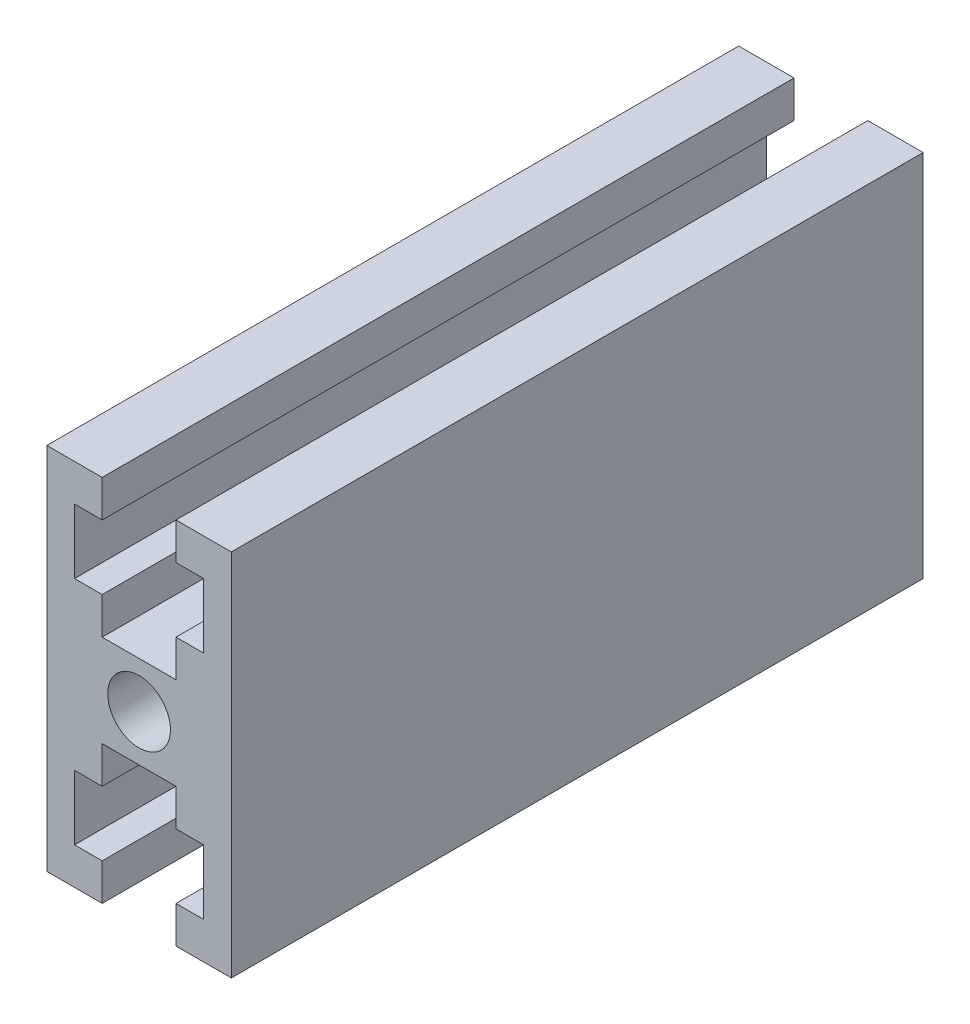
ISO-10303-21;
HEADER;
FILE_DESCRIPTION(('STEP AP214'),'2;1');
FILE_NAME('part.step','',(''),(''),'','','');
FILE_SCHEMA(('AUTOMOTIVE_DESIGN { 1 0 10303 214 1 1 1 1 }'));
ENDSEC;
DATA;
#1=APPLICATION_CONTEXT('core data for automotive mechanical design processes');
#2=APPLICATION_PROTOCOL_DEFINITION('international standard','automotive_design',2000,#1);
#3=PRODUCT_CONTEXT('',#1,'mechanical');
#4=PRODUCT('Part','Part','',(#3));
#5=PRODUCT_RELATED_PRODUCT_CATEGORY('part','',(#4));
#6=PRODUCT_DEFINITION_FORMATION('','',#4);
#7=PRODUCT_DEFINITION_CONTEXT('part definition',#1,'design');
#8=PRODUCT_DEFINITION('design','',#6,#7);
#9=PRODUCT_DEFINITION_SHAPE('','',#8);
#10=(LENGTH_UNIT() NAMED_UNIT(*) SI_UNIT(.MILLI.,.METRE.));
#11=(NAMED_UNIT(*) PLANE_ANGLE_UNIT() SI_UNIT($,.RADIAN.));
#12=(NAMED_UNIT(*) SI_UNIT($,.STERADIAN.) SOLID_ANGLE_UNIT());
#13=UNCERTAINTY_MEASURE_WITH_UNIT(LENGTH_MEASURE(1.E-05),#10,'distance_accuracy_value','');
#14=(GEOMETRIC_REPRESENTATION_CONTEXT(3) GLOBAL_UNCERTAINTY_ASSIGNED_CONTEXT((#13)) GLOBAL_UNIT_ASSIGNED_CONTEXT((#10,
#11,#12)) REPRESENTATION_CONTEXT('',''));
#15=CARTESIAN_POINT('',(0.,0.,0.));
#16=DIRECTION('',(0.,0.,1.));
#17=DIRECTION('',(1.,0.,0.));
#18=AXIS2_PLACEMENT_3D('',#15,#16,#17);
#19=CARTESIAN_POINT('',(0.,0.,75.));
#20=DIRECTION('',(0.,0.,1.));
#21=DIRECTION('',(1.,0.,0.));
#22=AXIS2_PLACEMENT_3D('',#19,#20,#21);
#23=PLANE('',#22);
#24=DIRECTION('',(0.,-1.,0.));
#25=VECTOR('',#24,1.);
#26=CARTESIAN_POINT('',(0.,0.,75.));
#27=LINE('',#26,#25);
#28=CARTESIAN_POINT('',(0.,0.,75.));
#29=VERTEX_POINT('',#28);
#30=CARTESIAN_POINT('',(0.,-40.,75.));
#31=VERTEX_POINT('',#30);
#32=EDGE_CURVE('E305',#29,#31,#27,.T.);
#33=ORIENTED_EDGE('',*,*,#32,.T.);
#34=DIRECTION('',(1.,0.,0.));
#35=VECTOR('',#34,1.);
#36=CARTESIAN_POINT('',(0.,-40.,75.));
#37=LINE('',#36,#35);
#38=CARTESIAN_POINT('',(6.,-40.,75.));
#39=VERTEX_POINT('',#38);
#40=EDGE_CURVE('E153',#31,#39,#37,.T.);
#41=ORIENTED_EDGE('',*,*,#40,.T.);
#42=DIRECTION('',(0.,1.,0.));
#43=VECTOR('',#42,1.);
#44=CARTESIAN_POINT('',(6.,-40.,75.));
#45=LINE('',#44,#43);
#46=CARTESIAN_POINT('',(6.,-36.,75.));
#47=VERTEX_POINT('',#46);
#48=EDGE_CURVE('E380',#39,#47,#45,.T.);
#49=ORIENTED_EDGE('',*,*,#48,.T.);
#50=DIRECTION('',(-1.,0.,0.));
#51=VECTOR('',#50,1.);
#52=CARTESIAN_POINT('',(6.,-36.,75.));
#53=LINE('',#52,#51);
#54=CARTESIAN_POINT('',(3.,-36.,75.));
#55=VERTEX_POINT('',#54);
#56=EDGE_CURVE('E399',#47,#55,#53,.T.);
#57=ORIENTED_EDGE('',*,*,#56,.T.);
#58=DIRECTION('',(0.,1.,0.));
#59=VECTOR('',#58,1.);
#60=CARTESIAN_POINT('',(3.,-36.,75.));
#61=LINE('',#60,#59);
#62=CARTESIAN_POINT('',(3.,-29.,75.));
#63=VERTEX_POINT('',#62);
#64=EDGE_CURVE('E396',#55,#63,#61,.T.);
#65=ORIENTED_EDGE('',*,*,#64,.T.);
#66=DIRECTION('',(1.,0.,0.));
#67=VECTOR('',#66,1.);
#68=CARTESIAN_POINT('',(3.,-29.,75.));
#69=LINE('',#68,#67);
#70=CARTESIAN_POINT('',(6.,-29.,75.));
#71=VERTEX_POINT('',#70);
#72=EDGE_CURVE('E398',#63,#71,#69,.T.);
#73=ORIENTED_EDGE('',*,*,#72,.T.);
#74=DIRECTION('',(0.,1.,0.));
#75=VECTOR('',#74,1.);
#76=CARTESIAN_POINT('',(6.,-29.,75.));
#77=LINE('',#76,#75);
#78=CARTESIAN_POINT('',(6.,-25.,75.));
#79=VERTEX_POINT('',#78);
#80=EDGE_CURVE('E401',#71,#79,#77,.T.);
#81=ORIENTED_EDGE('',*,*,#80,.T.);
#82=DIRECTION('',(1.,0.,0.));
#83=VECTOR('',#82,1.);
#84=CARTESIAN_POINT('',(6.,-25.,75.));
#85=LINE('',#84,#83);
#86=CARTESIAN_POINT('',(14.,-25.,75.));
#87=VERTEX_POINT('',#86);
#88=EDGE_CURVE('E407',#79,#87,#85,.T.);
#89=ORIENTED_EDGE('',*,*,#88,.T.);
#90=DIRECTION('',(0.,-1.,0.));
#91=VECTOR('',#90,1.);
#92=CARTESIAN_POINT('',(14.,-25.,75.));
#93=LINE('',#92,#91);
#94=CARTESIAN_POINT('',(14.,-29.,75.));
#95=VERTEX_POINT('',#94);
#96=EDGE_CURVE('E409',#87,#95,#93,.T.);
#97=ORIENTED_EDGE('',*,*,#96,.T.);
#98=DIRECTION('',(1.,0.,0.));
#99=VECTOR('',#98,1.);
#100=CARTESIAN_POINT('',(14.,-29.,75.));
#101=LINE('',#100,#99);
#102=CARTESIAN_POINT('',(17.,-29.,75.));
#103=VERTEX_POINT('',#102);
#104=EDGE_CURVE('E411',#95,#103,#101,.T.);
#105=ORIENTED_EDGE('',*,*,#104,.T.);
#106=DIRECTION('',(0.,-1.,0.));
#107=VECTOR('',#106,1.);
#108=CARTESIAN_POINT('',(17.,-29.,75.));
#109=LINE('',#108,#107);
#110=CARTESIAN_POINT('',(17.,-36.,75.));
#111=VERTEX_POINT('',#110);
#112=EDGE_CURVE('E413',#103,#111,#109,.T.);
#113=ORIENTED_EDGE('',*,*,#112,.T.);
#114=DIRECTION('',(-1.,0.,0.));
#115=VECTOR('',#114,1.);
#116=CARTESIAN_POINT('',(17.,-36.,75.));
#117=LINE('',#116,#115);
#118=CARTESIAN_POINT('',(14.,-36.,75.));
#119=VERTEX_POINT('',#118);
#120=EDGE_CURVE('E415',#111,#119,#117,.T.);
#121=ORIENTED_EDGE('',*,*,#120,.T.);
#122=DIRECTION('',(0.,-1.,0.));
#123=VECTOR('',#122,1.);
#124=CARTESIAN_POINT('',(14.,-36.,75.));
#125=LINE('',#124,#123);
#126=CARTESIAN_POINT('',(14.,-40.,75.));
#127=VERTEX_POINT('',#126);
#128=EDGE_CURVE('E417',#119,#127,#125,.T.);
#129=ORIENTED_EDGE('',*,*,#128,.T.);
#130=DIRECTION('',(1.,0.,0.));
#131=VECTOR('',#130,1.);
#132=CARTESIAN_POINT('',(14.,-40.,75.));
#133=LINE('',#132,#131);
#134=CARTESIAN_POINT('',(20.,-40.,75.));
#135=VERTEX_POINT('',#134);
#136=EDGE_CURVE('E419',#127,#135,#133,.T.);
#137=ORIENTED_EDGE('',*,*,#136,.T.);
#138=DIRECTION('',(0.,1.,0.));
#139=VECTOR('',#138,1.);
#140=CARTESIAN_POINT('',(20.,0.,75.));
#141=LINE('',#140,#139);
#142=CARTESIAN_POINT('',(20.,0.,75.));
#143=VERTEX_POINT('',#142);
#144=EDGE_CURVE('E421',#135,#143,#141,.T.);
#145=ORIENTED_EDGE('',*,*,#144,.T.);
#146=DIRECTION('',(-1.,0.,0.));
#147=VECTOR('',#146,1.);
#148=CARTESIAN_POINT('',(14.,0.,75.));
#149=LINE('',#148,#147);
#150=CARTESIAN_POINT('',(14.,0.,75.));
#151=VERTEX_POINT('',#150);
#152=EDGE_CURVE('E423',#143,#151,#149,.T.);
#153=ORIENTED_EDGE('',*,*,#152,.T.);
#154=DIRECTION('',(0.,-1.,0.));
#155=VECTOR('',#154,1.);
#156=CARTESIAN_POINT('',(14.,-4.,75.));
#157=LINE('',#156,#155);
#158=CARTESIAN_POINT('',(14.,-4.,75.));
#159=VERTEX_POINT('',#158);
#160=EDGE_CURVE('E425',#151,#159,#157,.T.);
#161=ORIENTED_EDGE('',*,*,#160,.T.);
#162=DIRECTION('',(1.,0.,0.));
#163=VECTOR('',#162,1.);
#164=CARTESIAN_POINT('',(17.,-4.,75.));
#165=LINE('',#164,#163);
#166=CARTESIAN_POINT('',(17.,-4.,75.));
#167=VERTEX_POINT('',#166);
#168=EDGE_CURVE('E427',#159,#167,#165,.T.);
#169=ORIENTED_EDGE('',*,*,#168,.T.);
#170=DIRECTION('',(0.,-1.,0.));
#171=VECTOR('',#170,1.);
#172=CARTESIAN_POINT('',(17.,-11.,75.));
#173=LINE('',#172,#171);
#174=CARTESIAN_POINT('',(17.,-11.,75.));
#175=VERTEX_POINT('',#174);
#176=EDGE_CURVE('E429',#167,#175,#173,.T.);
#177=ORIENTED_EDGE('',*,*,#176,.T.);
#178=DIRECTION('',(-1.,0.,0.));
#179=VECTOR('',#178,1.);
#180=CARTESIAN_POINT('',(14.,-11.,75.));
#181=LINE('',#180,#179);
#182=CARTESIAN_POINT('',(14.,-11.,75.));
#183=VERTEX_POINT('',#182);
#184=EDGE_CURVE('E431',#175,#183,#181,.T.);
#185=ORIENTED_EDGE('',*,*,#184,.T.);
#186=DIRECTION('',(0.,-1.,0.));
#187=VECTOR('',#186,1.);
#188=CARTESIAN_POINT('',(14.,-15.,75.));
#189=LINE('',#188,#187);
#190=CARTESIAN_POINT('',(14.,-15.,75.));
#191=VERTEX_POINT('',#190);
#192=EDGE_CURVE('E433',#183,#191,#189,.T.);
#193=ORIENTED_EDGE('',*,*,#192,.T.);
#194=DIRECTION('',(-1.,0.,0.));
#195=VECTOR('',#194,1.);
#196=CARTESIAN_POINT('',(6.,-15.,75.));
#197=LINE('',#196,#195);
#198=CARTESIAN_POINT('',(6.,-15.,75.));
#199=VERTEX_POINT('',#198);
#200=EDGE_CURVE('E435',#191,#199,#197,.T.);
#201=ORIENTED_EDGE('',*,*,#200,.T.);
#202=DIRECTION('',(0.,1.,0.));
#203=VECTOR('',#202,1.);
#204=CARTESIAN_POINT('',(6.,-11.,75.));
#205=LINE('',#204,#203);
#206=CARTESIAN_POINT('',(6.,-11.,75.));
#207=VERTEX_POINT('',#206);
#208=EDGE_CURVE('E437',#199,#207,#205,.T.);
#209=ORIENTED_EDGE('',*,*,#208,.T.);
#210=DIRECTION('',(-1.,0.,0.));
#211=VECTOR('',#210,1.);
#212=CARTESIAN_POINT('',(3.,-11.,75.));
#213=LINE('',#212,#211);
#214=CARTESIAN_POINT('',(3.,-11.,75.));
#215=VERTEX_POINT('',#214);
#216=EDGE_CURVE('E439',#207,#215,#213,.T.);
#217=ORIENTED_EDGE('',*,*,#216,.T.);
#218=DIRECTION('',(0.,1.,0.));
#219=VECTOR('',#218,1.);
#220=CARTESIAN_POINT('',(3.,-4.,75.));
#221=LINE('',#220,#219);
#222=CARTESIAN_POINT('',(3.,-4.,75.));
#223=VERTEX_POINT('',#222);
#224=EDGE_CURVE('E232',#215,#223,#221,.T.);
#225=ORIENTED_EDGE('',*,*,#224,.T.);
#226=DIRECTION('',(1.,0.,0.));
#227=VECTOR('',#226,1.);
#228=CARTESIAN_POINT('',(6.,-4.,75.));
#229=LINE('',#228,#227);
#230=CARTESIAN_POINT('',(6.,-4.,75.));
#231=VERTEX_POINT('',#230);
#232=EDGE_CURVE('E226',#223,#231,#229,.T.);
#233=ORIENTED_EDGE('',*,*,#232,.T.);
#234=DIRECTION('',(0.,1.,0.));
#235=VECTOR('',#234,1.);
#236=CARTESIAN_POINT('',(6.,0.,75.));
#237=LINE('',#236,#235);
#238=CARTESIAN_POINT('',(6.,0.,75.));
#239=VERTEX_POINT('',#238);
#240=EDGE_CURVE('E230',#231,#239,#237,.T.);
#241=ORIENTED_EDGE('',*,*,#240,.T.);
#242=DIRECTION('',(-1.,0.,0.));
#243=VECTOR('',#242,1.);
#244=CARTESIAN_POINT('',(0.,0.,75.));
#245=LINE('',#244,#243);
#246=EDGE_CURVE('E50',#239,#29,#245,.T.);
#247=ORIENTED_EDGE('',*,*,#246,.T.);
#248=EDGE_LOOP('',(#33,#41,#49,#57,#65,#73,#81,#89,#97,#105,#113,#121,#129,#137,#145,#153,#161,
#169,#177,#185,#193,#201,#209,#217,#225,#233,#241,#247));
#249=FACE_BOUND('',#248,.T.);
#250=CARTESIAN_POINT('',(10.,-20.,75.));
#251=DIRECTION('',(0.,0.,1.));
#252=DIRECTION('',(-1.,0.,0.));
#253=AXIS2_PLACEMENT_3D('',#250,#251,#252);
#254=CIRCLE('',#253,3.4);
#255=CARTESIAN_POINT('',(6.6,-20.,75.));
#256=VERTEX_POINT('',#255);
#257=EDGE_CURVE('E254',#256,#256,#254,.T.);
#258=ORIENTED_EDGE('',*,*,#257,.F.);
#259=EDGE_LOOP('',(#258));
#260=FACE_BOUND('',#259,.T.);
#261=ADVANCED_FACE('F33',(#249,#260),#23,.T.);
#262=CARTESIAN_POINT('',(0.,0.,0.));
#263=DIRECTION('',(0.,0.,1.));
#264=DIRECTION('',(1.,0.,0.));
#265=AXIS2_PLACEMENT_3D('',#262,#263,#264);
#266=PLANE('',#265);
#267=DIRECTION('',(0.,-1.,0.));
#268=VECTOR('',#267,1.);
#269=CARTESIAN_POINT('',(0.,0.,0.));
#270=LINE('',#269,#268);
#271=CARTESIAN_POINT('',(0.,0.,0.));
#272=VERTEX_POINT('',#271);
#273=CARTESIAN_POINT('',(0.,-40.,0.));
#274=VERTEX_POINT('',#273);
#275=EDGE_CURVE('E250',#272,#274,#270,.T.);
#276=ORIENTED_EDGE('',*,*,#275,.F.);
#277=DIRECTION('',(-1.,0.,0.));
#278=VECTOR('',#277,1.);
#279=CARTESIAN_POINT('',(0.,0.,0.));
#280=LINE('',#279,#278);
#281=CARTESIAN_POINT('',(6.,0.,0.));
#282=VERTEX_POINT('',#281);
#283=EDGE_CURVE('E145',#282,#272,#280,.T.);
#284=ORIENTED_EDGE('',*,*,#283,.F.);
#285=DIRECTION('',(0.,1.,0.));
#286=VECTOR('',#285,1.);
#287=CARTESIAN_POINT('',(6.,0.,0.));
#288=LINE('',#287,#286);
#289=CARTESIAN_POINT('',(6.,-4.,0.));
#290=VERTEX_POINT('',#289);
#291=EDGE_CURVE('E139',#290,#282,#288,.T.);
#292=ORIENTED_EDGE('',*,*,#291,.F.);
#293=DIRECTION('',(1.,0.,0.));
#294=VECTOR('',#293,1.);
#295=CARTESIAN_POINT('',(6.,-4.,0.));
#296=LINE('',#295,#294);
#297=CARTESIAN_POINT('',(3.,-4.,0.));
#298=VERTEX_POINT('',#297);
#299=EDGE_CURVE('E240',#298,#290,#296,.T.);
#300=ORIENTED_EDGE('',*,*,#299,.F.);
#301=DIRECTION('',(0.,1.,0.));
#302=VECTOR('',#301,1.);
#303=CARTESIAN_POINT('',(3.,-4.,0.));
#304=LINE('',#303,#302);
#305=CARTESIAN_POINT('',(3.,-11.,0.));
#306=VERTEX_POINT('',#305);
#307=EDGE_CURVE('E300',#306,#298,#304,.T.);
#308=ORIENTED_EDGE('',*,*,#307,.F.);
#309=DIRECTION('',(-1.,0.,0.));
#310=VECTOR('',#309,1.);
#311=CARTESIAN_POINT('',(3.,-11.,0.));
#312=LINE('',#311,#310);
#313=CARTESIAN_POINT('',(6.,-11.,0.));
#314=VERTEX_POINT('',#313);
#315=EDGE_CURVE('E298',#314,#306,#312,.T.);
#316=ORIENTED_EDGE('',*,*,#315,.F.);
#317=DIRECTION('',(0.,1.,0.));
#318=VECTOR('',#317,1.);
#319=CARTESIAN_POINT('',(6.,-11.,0.));
#320=LINE('',#319,#318);
#321=CARTESIAN_POINT('',(6.,-15.,0.));
#322=VERTEX_POINT('',#321);
#323=EDGE_CURVE('E296',#322,#314,#320,.T.);
#324=ORIENTED_EDGE('',*,*,#323,.F.);
#325=DIRECTION('',(-1.,0.,0.));
#326=VECTOR('',#325,1.);
#327=CARTESIAN_POINT('',(6.,-15.,0.));
#328=LINE('',#327,#326);
#329=CARTESIAN_POINT('',(14.,-15.,0.));
#330=VERTEX_POINT('',#329);
#331=EDGE_CURVE('E294',#330,#322,#328,.T.);
#332=ORIENTED_EDGE('',*,*,#331,.F.);
#333=DIRECTION('',(0.,-1.,0.));
#334=VECTOR('',#333,1.);
#335=CARTESIAN_POINT('',(14.,-15.,0.));
#336=LINE('',#335,#334);
#337=CARTESIAN_POINT('',(14.,-11.,0.));
#338=VERTEX_POINT('',#337);
#339=EDGE_CURVE('E292',#338,#330,#336,.T.);
#340=ORIENTED_EDGE('',*,*,#339,.F.);
#341=DIRECTION('',(-1.,0.,0.));
#342=VECTOR('',#341,1.);
#343=CARTESIAN_POINT('',(14.,-11.,0.));
#344=LINE('',#343,#342);
#345=CARTESIAN_POINT('',(17.,-11.,0.));
#346=VERTEX_POINT('',#345);
#347=EDGE_CURVE('E290',#346,#338,#344,.T.);
#348=ORIENTED_EDGE('',*,*,#347,.F.);
#349=DIRECTION('',(0.,-1.,0.));
#350=VECTOR('',#349,1.);
#351=CARTESIAN_POINT('',(17.,-11.,0.));
#352=LINE('',#351,#350);
#353=CARTESIAN_POINT('',(17.,-4.,0.));
#354=VERTEX_POINT('',#353);
#355=EDGE_CURVE('E288',#354,#346,#352,.T.);
#356=ORIENTED_EDGE('',*,*,#355,.F.);
#357=DIRECTION('',(1.,0.,0.));
#358=VECTOR('',#357,1.);
#359=CARTESIAN_POINT('',(17.,-4.,0.));
#360=LINE('',#359,#358);
#361=CARTESIAN_POINT('',(14.,-4.,0.));
#362=VERTEX_POINT('',#361);
#363=EDGE_CURVE('E286',#362,#354,#360,.T.);
#364=ORIENTED_EDGE('',*,*,#363,.F.);
#365=DIRECTION('',(0.,-1.,0.));
#366=VECTOR('',#365,1.);
#367=CARTESIAN_POINT('',(14.,-4.,0.));
#368=LINE('',#367,#366);
#369=CARTESIAN_POINT('',(14.,0.,0.));
#370=VERTEX_POINT('',#369);
#371=EDGE_CURVE('E284',#370,#362,#368,.T.);
#372=ORIENTED_EDGE('',*,*,#371,.F.);
#373=DIRECTION('',(-1.,0.,0.));
#374=VECTOR('',#373,1.);
#375=CARTESIAN_POINT('',(14.,0.,0.));
#376=LINE('',#375,#374);
#377=CARTESIAN_POINT('',(20.,0.,0.));
#378=VERTEX_POINT('',#377);
#379=EDGE_CURVE('E282',#378,#370,#376,.T.);
#380=ORIENTED_EDGE('',*,*,#379,.F.);
#381=DIRECTION('',(0.,1.,0.));
#382=VECTOR('',#381,1.);
#383=CARTESIAN_POINT('',(20.,0.,0.));
#384=LINE('',#383,#382);
#385=CARTESIAN_POINT('',(20.,-40.,0.));
#386=VERTEX_POINT('',#385);
#387=EDGE_CURVE('E280',#386,#378,#384,.T.);
#388=ORIENTED_EDGE('',*,*,#387,.F.);
#389=DIRECTION('',(1.,0.,0.));
#390=VECTOR('',#389,1.);
#391=CARTESIAN_POINT('',(14.,-40.,0.));
#392=LINE('',#391,#390);
#393=CARTESIAN_POINT('',(14.,-40.,0.));
#394=VERTEX_POINT('',#393);
#395=EDGE_CURVE('E278',#394,#386,#392,.T.);
#396=ORIENTED_EDGE('',*,*,#395,.F.);
#397=DIRECTION('',(0.,-1.,0.));
#398=VECTOR('',#397,1.);
#399=CARTESIAN_POINT('',(14.,-36.,0.));
#400=LINE('',#399,#398);
#401=CARTESIAN_POINT('',(14.,-36.,0.));
#402=VERTEX_POINT('',#401);
#403=EDGE_CURVE('E276',#402,#394,#400,.T.);
#404=ORIENTED_EDGE('',*,*,#403,.F.);
#405=DIRECTION('',(-1.,0.,0.));
#406=VECTOR('',#405,1.);
#407=CARTESIAN_POINT('',(17.,-36.,0.));
#408=LINE('',#407,#406);
#409=CARTESIAN_POINT('',(17.,-36.,0.));
#410=VERTEX_POINT('',#409);
#411=EDGE_CURVE('E274',#410,#402,#408,.T.);
#412=ORIENTED_EDGE('',*,*,#411,.F.);
#413=DIRECTION('',(0.,-1.,0.));
#414=VECTOR('',#413,1.);
#415=CARTESIAN_POINT('',(17.,-29.,0.));
#416=LINE('',#415,#414);
#417=CARTESIAN_POINT('',(17.,-29.,0.));
#418=VERTEX_POINT('',#417);
#419=EDGE_CURVE('E272',#418,#410,#416,.T.);
#420=ORIENTED_EDGE('',*,*,#419,.F.);
#421=DIRECTION('',(1.,0.,0.));
#422=VECTOR('',#421,1.);
#423=CARTESIAN_POINT('',(14.,-29.,0.));
#424=LINE('',#423,#422);
#425=CARTESIAN_POINT('',(14.,-29.,0.));
#426=VERTEX_POINT('',#425);
#427=EDGE_CURVE('E270',#426,#418,#424,.T.);
#428=ORIENTED_EDGE('',*,*,#427,.F.);
#429=DIRECTION('',(0.,-1.,0.));
#430=VECTOR('',#429,1.);
#431=CARTESIAN_POINT('',(14.,-25.,0.));
#432=LINE('',#431,#430);
#433=CARTESIAN_POINT('',(14.,-25.,0.));
#434=VERTEX_POINT('',#433);
#435=EDGE_CURVE('E268',#434,#426,#432,.T.);
#436=ORIENTED_EDGE('',*,*,#435,.F.);
#437=DIRECTION('',(1.,0.,0.));
#438=VECTOR('',#437,1.);
#439=CARTESIAN_POINT('',(6.,-25.,0.));
#440=LINE('',#439,#438);
#441=CARTESIAN_POINT('',(6.,-25.,0.));
#442=VERTEX_POINT('',#441);
#443=EDGE_CURVE('E266',#442,#434,#440,.T.);
#444=ORIENTED_EDGE('',*,*,#443,.F.);
#445=DIRECTION('',(0.,1.,0.));
#446=VECTOR('',#445,1.);
#447=CARTESIAN_POINT('',(6.,-29.,0.));
#448=LINE('',#447,#446);
#449=CARTESIAN_POINT('',(6.,-29.,0.));
#450=VERTEX_POINT('',#449);
#451=EDGE_CURVE('E264',#450,#442,#448,.T.);
#452=ORIENTED_EDGE('',*,*,#451,.F.);
#453=DIRECTION('',(1.,0.,0.));
#454=VECTOR('',#453,1.);
#455=CARTESIAN_POINT('',(3.,-29.,0.));
#456=LINE('',#455,#454);
#457=CARTESIAN_POINT('',(3.,-29.,0.));
#458=VERTEX_POINT('',#457);
#459=EDGE_CURVE('E262',#458,#450,#456,.T.);
#460=ORIENTED_EDGE('',*,*,#459,.F.);
#461=DIRECTION('',(0.,1.,0.));
#462=VECTOR('',#461,1.);
#463=CARTESIAN_POINT('',(3.,-36.,0.));
#464=LINE('',#463,#462);
#465=CARTESIAN_POINT('',(3.,-36.,0.));
#466=VERTEX_POINT('',#465);
#467=EDGE_CURVE('E260',#466,#458,#464,.T.);
#468=ORIENTED_EDGE('',*,*,#467,.F.);
#469=DIRECTION('',(-1.,0.,0.));
#470=VECTOR('',#469,1.);
#471=CARTESIAN_POINT('',(6.,-36.,0.));
#472=LINE('',#471,#470);
#473=CARTESIAN_POINT('',(6.,-36.,0.));
#474=VERTEX_POINT('',#473);
#475=EDGE_CURVE('E258',#474,#466,#472,.T.);
#476=ORIENTED_EDGE('',*,*,#475,.F.);
#477=DIRECTION('',(0.,1.,0.));
#478=VECTOR('',#477,1.);
#479=CARTESIAN_POINT('',(6.,-40.,0.));
#480=LINE('',#479,#478);
#481=CARTESIAN_POINT('',(6.,-40.,0.));
#482=VERTEX_POINT('',#481);
#483=EDGE_CURVE('E256',#482,#474,#480,.T.);
#484=ORIENTED_EDGE('',*,*,#483,.F.);
#485=DIRECTION('',(1.,0.,0.));
#486=VECTOR('',#485,1.);
#487=CARTESIAN_POINT('',(0.,-40.,0.));
#488=LINE('',#487,#486);
#489=EDGE_CURVE('E253',#274,#482,#488,.T.);
#490=ORIENTED_EDGE('',*,*,#489,.F.);
#491=EDGE_LOOP('',(#276,#284,#292,#300,#308,#316,#324,#332,#340,#348,#356,#364,#372,#380,#388,
#396,#404,#412,#420,#428,#436,#444,#452,#460,#468,#476,#484,#490));
#492=FACE_BOUND('',#491,.T.);
#493=CARTESIAN_POINT('',(10.,-20.,0.));
#494=DIRECTION('',(0.,0.,1.));
#495=DIRECTION('',(-1.,0.,0.));
#496=AXIS2_PLACEMENT_3D('',#493,#494,#495);
#497=CIRCLE('',#496,3.4);
#498=CARTESIAN_POINT('',(6.6,-20.,0.));
#499=VERTEX_POINT('',#498);
#500=EDGE_CURVE('E794',#499,#499,#497,.T.);
#501=ORIENTED_EDGE('',*,*,#500,.T.);
#502=EDGE_LOOP('',(#501));
#503=FACE_BOUND('',#502,.T.);
#504=ADVANCED_FACE('F384',(#492,#503),#266,.F.);
#505=CARTESIAN_POINT('',(0.,0.,75.));
#506=DIRECTION('',(1.,0.,0.));
#507=DIRECTION('',(0.,0.,-1.));
#508=AXIS2_PLACEMENT_3D('',#505,#506,#507);
#509=PLANE('',#508);
#510=ORIENTED_EDGE('',*,*,#275,.T.);
#511=DIRECTION('',(0.,0.,-1.));
#512=VECTOR('',#511,1.);
#513=CARTESIAN_POINT('',(0.,-40.,75.));
#514=LINE('',#513,#512);
#515=EDGE_CURVE('E11',#31,#274,#514,.T.);
#516=ORIENTED_EDGE('',*,*,#515,.F.);
#517=ORIENTED_EDGE('',*,*,#32,.F.);
#518=DIRECTION('',(0.,0.,-1.));
#519=VECTOR('',#518,1.);
#520=CARTESIAN_POINT('',(0.,0.,75.));
#521=LINE('',#520,#519);
#522=EDGE_CURVE('E246',#29,#272,#521,.T.);
#523=ORIENTED_EDGE('',*,*,#522,.T.);
#524=EDGE_LOOP('',(#510,#516,#517,#523));
#525=FACE_BOUND('',#524,.T.);
#526=ADVANCED_FACE('F35',(#525),#509,.F.);
#527=CARTESIAN_POINT('',(0.,-40.,75.));
#528=DIRECTION('',(0.,1.,0.));
#529=DIRECTION('',(0.,0.,1.));
#530=AXIS2_PLACEMENT_3D('',#527,#528,#529);
#531=PLANE('',#530);
#532=ORIENTED_EDGE('',*,*,#489,.T.);
#533=DIRECTION('',(0.,0.,-1.));
#534=VECTOR('',#533,1.);
#535=CARTESIAN_POINT('',(6.,-40.,75.));
#536=LINE('',#535,#534);
#537=EDGE_CURVE('E42',#39,#482,#536,.T.);
#538=ORIENTED_EDGE('',*,*,#537,.F.);
#539=ORIENTED_EDGE('',*,*,#40,.F.);
#540=ORIENTED_EDGE('',*,*,#515,.T.);
#541=EDGE_LOOP('',(#532,#538,#539,#540));
#542=FACE_BOUND('',#541,.T.);
#543=ADVANCED_FACE('F473',(#542),#531,.F.);
#544=CARTESIAN_POINT('',(6.,-40.,75.));
#545=DIRECTION('',(-1.,0.,0.));
#546=DIRECTION('',(0.,0.,1.));
#547=AXIS2_PLACEMENT_3D('',#544,#545,#546);
#548=PLANE('',#547);
#549=ORIENTED_EDGE('',*,*,#483,.T.);
#550=DIRECTION('',(0.,0.,-1.));
#551=VECTOR('',#550,1.);
#552=CARTESIAN_POINT('',(6.,-36.,75.));
#553=LINE('',#552,#551);
#554=EDGE_CURVE('E372',#47,#474,#553,.T.);
#555=ORIENTED_EDGE('',*,*,#554,.F.);
#556=ORIENTED_EDGE('',*,*,#48,.F.);
#557=ORIENTED_EDGE('',*,*,#537,.T.);
#558=EDGE_LOOP('',(#549,#555,#556,#557));
#559=FACE_BOUND('',#558,.T.);
#560=ADVANCED_FACE('F378',(#559),#548,.F.);
#561=CARTESIAN_POINT('',(6.,-36.,75.));
#562=DIRECTION('',(0.,-1.,0.));
#563=DIRECTION('',(0.,0.,-1.));
#564=AXIS2_PLACEMENT_3D('',#561,#562,#563);
#565=PLANE('',#564);
#566=ORIENTED_EDGE('',*,*,#475,.T.);
#567=DIRECTION('',(0.,0.,-1.));
#568=VECTOR('',#567,1.);
#569=CARTESIAN_POINT('',(3.,-36.,75.));
#570=LINE('',#569,#568);
#571=EDGE_CURVE('E369',#55,#466,#570,.T.);
#572=ORIENTED_EDGE('',*,*,#571,.F.);
#573=ORIENTED_EDGE('',*,*,#56,.F.);
#574=ORIENTED_EDGE('',*,*,#554,.T.);
#575=EDGE_LOOP('',(#566,#572,#573,#574));
#576=FACE_BOUND('',#575,.T.);
#577=ADVANCED_FACE('F390',(#576),#565,.F.);
#578=CARTESIAN_POINT('',(3.,-36.,75.));
#579=DIRECTION('',(-1.,0.,0.));
#580=DIRECTION('',(0.,-1.,0.));
#581=AXIS2_PLACEMENT_3D('',#578,#579,#580);
#582=PLANE('',#581);
#583=ORIENTED_EDGE('',*,*,#467,.T.);
#584=DIRECTION('',(0.,0.,-1.));
#585=VECTOR('',#584,1.);
#586=CARTESIAN_POINT('',(3.,-29.,75.));
#587=LINE('',#586,#585);
#588=EDGE_CURVE('E366',#63,#458,#587,.T.);
#589=ORIENTED_EDGE('',*,*,#588,.F.);
#590=ORIENTED_EDGE('',*,*,#64,.F.);
#591=ORIENTED_EDGE('',*,*,#571,.T.);
#592=EDGE_LOOP('',(#583,#589,#590,#591));
#593=FACE_BOUND('',#592,.T.);
#594=ADVANCED_FACE('F394',(#593),#582,.F.);
#595=CARTESIAN_POINT('',(3.,-29.,75.));
#596=DIRECTION('',(0.,1.,0.));
#597=DIRECTION('',(0.,0.,1.));
#598=AXIS2_PLACEMENT_3D('',#595,#596,#597);
#599=PLANE('',#598);
#600=ORIENTED_EDGE('',*,*,#459,.T.);
#601=DIRECTION('',(0.,0.,-1.));
#602=VECTOR('',#601,1.);
#603=CARTESIAN_POINT('',(6.,-29.,75.));
#604=LINE('',#603,#602);
#605=EDGE_CURVE('E363',#71,#450,#604,.T.);
#606=ORIENTED_EDGE('',*,*,#605,.F.);
#607=ORIENTED_EDGE('',*,*,#72,.F.);
#608=ORIENTED_EDGE('',*,*,#588,.T.);
#609=EDGE_LOOP('',(#600,#606,#607,#608));
#610=FACE_BOUND('',#609,.T.);
#611=ADVANCED_FACE('F486',(#610),#599,.F.);
#612=CARTESIAN_POINT('',(6.,-29.,75.));
#613=DIRECTION('',(-1.,0.,0.));
#614=DIRECTION('',(0.,-1.,0.));
#615=AXIS2_PLACEMENT_3D('',#612,#613,#614);
#616=PLANE('',#615);
#617=ORIENTED_EDGE('',*,*,#451,.T.);
#618=DIRECTION('',(0.,0.,-1.));
#619=VECTOR('',#618,1.);
#620=CARTESIAN_POINT('',(6.,-25.,75.));
#621=LINE('',#620,#619);
#622=EDGE_CURVE('E360',#79,#442,#621,.T.);
#623=ORIENTED_EDGE('',*,*,#622,.F.);
#624=ORIENTED_EDGE('',*,*,#80,.F.);
#625=ORIENTED_EDGE('',*,*,#605,.T.);
#626=EDGE_LOOP('',(#617,#623,#624,#625));
#627=FACE_BOUND('',#626,.T.);
#628=ADVANCED_FACE('F489',(#627),#616,.F.);
#629=CARTESIAN_POINT('',(6.,-25.,75.));
#630=DIRECTION('',(0.,1.,0.));
#631=DIRECTION('',(0.,0.,1.));
#632=AXIS2_PLACEMENT_3D('',#629,#630,#631);
#633=PLANE('',#632);
#634=ORIENTED_EDGE('',*,*,#443,.T.);
#635=DIRECTION('',(0.,0.,-1.));
#636=VECTOR('',#635,1.);
#637=CARTESIAN_POINT('',(14.,-25.,75.));
#638=LINE('',#637,#636);
#639=EDGE_CURVE('E357',#87,#434,#638,.T.);
#640=ORIENTED_EDGE('',*,*,#639,.F.);
#641=ORIENTED_EDGE('',*,*,#88,.F.);
#642=ORIENTED_EDGE('',*,*,#622,.T.);
#643=EDGE_LOOP('',(#634,#640,#641,#642));
#644=FACE_BOUND('',#643,.T.);
#645=ADVANCED_FACE('F493',(#644),#633,.F.);
#646=CARTESIAN_POINT('',(14.,-25.,75.));
#647=DIRECTION('',(1.,0.,0.));
#648=DIRECTION('',(0.,1.,0.));
#649=AXIS2_PLACEMENT_3D('',#646,#647,#648);
#650=PLANE('',#649);
#651=ORIENTED_EDGE('',*,*,#435,.T.);
#652=DIRECTION('',(0.,0.,-1.));
#653=VECTOR('',#652,1.);
#654=CARTESIAN_POINT('',(14.,-29.,75.));
#655=LINE('',#654,#653);
#656=EDGE_CURVE('E354',#95,#426,#655,.T.);
#657=ORIENTED_EDGE('',*,*,#656,.F.);
#658=ORIENTED_EDGE('',*,*,#96,.F.);
#659=ORIENTED_EDGE('',*,*,#639,.T.);
#660=EDGE_LOOP('',(#651,#657,#658,#659));
#661=FACE_BOUND('',#660,.T.);
#662=ADVANCED_FACE('F497',(#661),#650,.F.);
#663=CARTESIAN_POINT('',(14.,-29.,75.));
#664=DIRECTION('',(0.,1.,0.));
#665=DIRECTION('',(0.,0.,1.));
#666=AXIS2_PLACEMENT_3D('',#663,#664,#665);
#667=PLANE('',#666);
#668=ORIENTED_EDGE('',*,*,#427,.T.);
#669=DIRECTION('',(0.,0.,-1.));
#670=VECTOR('',#669,1.);
#671=CARTESIAN_POINT('',(17.,-29.,75.));
#672=LINE('',#671,#670);
#673=EDGE_CURVE('E351',#103,#418,#672,.T.);
#674=ORIENTED_EDGE('',*,*,#673,.F.);
#675=ORIENTED_EDGE('',*,*,#104,.F.);
#676=ORIENTED_EDGE('',*,*,#656,.T.);
#677=EDGE_LOOP('',(#668,#674,#675,#676));
#678=FACE_BOUND('',#677,.T.);
#679=ADVANCED_FACE('F501',(#678),#667,.F.);
#680=CARTESIAN_POINT('',(17.,-29.,75.));
#681=DIRECTION('',(1.,0.,0.));
#682=DIRECTION('',(0.,0.,-1.));
#683=AXIS2_PLACEMENT_3D('',#680,#681,#682);
#684=PLANE('',#683);
#685=ORIENTED_EDGE('',*,*,#419,.T.);
#686=DIRECTION('',(0.,0.,-1.));
#687=VECTOR('',#686,1.);
#688=CARTESIAN_POINT('',(17.,-36.,75.));
#689=LINE('',#688,#687);
#690=EDGE_CURVE('E348',#111,#410,#689,.T.);
#691=ORIENTED_EDGE('',*,*,#690,.F.);
#692=ORIENTED_EDGE('',*,*,#112,.F.);
#693=ORIENTED_EDGE('',*,*,#673,.T.);
#694=EDGE_LOOP('',(#685,#691,#692,#693));
#695=FACE_BOUND('',#694,.T.);
#696=ADVANCED_FACE('F505',(#695),#684,.F.);
#697=CARTESIAN_POINT('',(17.,-36.,75.));
#698=DIRECTION('',(0.,-1.,0.));
#699=DIRECTION('',(1.,0.,0.));
#700=AXIS2_PLACEMENT_3D('',#697,#698,#699);
#701=PLANE('',#700);
#702=ORIENTED_EDGE('',*,*,#411,.T.);
#703=DIRECTION('',(0.,0.,-1.));
#704=VECTOR('',#703,1.);
#705=CARTESIAN_POINT('',(14.,-36.,75.));
#706=LINE('',#705,#704);
#707=EDGE_CURVE('E345',#119,#402,#706,.T.);
#708=ORIENTED_EDGE('',*,*,#707,.F.);
#709=ORIENTED_EDGE('',*,*,#120,.F.);
#710=ORIENTED_EDGE('',*,*,#690,.T.);
#711=EDGE_LOOP('',(#702,#708,#709,#710));
#712=FACE_BOUND('',#711,.T.);
#713=ADVANCED_FACE('F509',(#712),#701,.F.);
#714=CARTESIAN_POINT('',(14.,-36.,75.));
#715=DIRECTION('',(1.,0.,0.));
#716=DIRECTION('',(0.,0.,-1.));
#717=AXIS2_PLACEMENT_3D('',#714,#715,#716);
#718=PLANE('',#717);
#719=ORIENTED_EDGE('',*,*,#403,.T.);
#720=DIRECTION('',(0.,0.,-1.));
#721=VECTOR('',#720,1.);
#722=CARTESIAN_POINT('',(14.,-40.,75.));
#723=LINE('',#722,#721);
#724=EDGE_CURVE('E342',#127,#394,#723,.T.);
#725=ORIENTED_EDGE('',*,*,#724,.F.);
#726=ORIENTED_EDGE('',*,*,#128,.F.);
#727=ORIENTED_EDGE('',*,*,#707,.T.);
#728=EDGE_LOOP('',(#719,#725,#726,#727));
#729=FACE_BOUND('',#728,.T.);
#730=ADVANCED_FACE('F513',(#729),#718,.F.);
#731=CARTESIAN_POINT('',(14.,-40.,75.));
#732=DIRECTION('',(0.,1.,0.));
#733=DIRECTION('',(0.,0.,1.));
#734=AXIS2_PLACEMENT_3D('',#731,#732,#733);
#735=PLANE('',#734);
#736=ORIENTED_EDGE('',*,*,#395,.T.);
#737=DIRECTION('',(0.,0.,-1.));
#738=VECTOR('',#737,1.);
#739=CARTESIAN_POINT('',(20.,-40.,75.));
#740=LINE('',#739,#738);
#741=EDGE_CURVE('E339',#135,#386,#740,.T.);
#742=ORIENTED_EDGE('',*,*,#741,.F.);
#743=ORIENTED_EDGE('',*,*,#136,.F.);
#744=ORIENTED_EDGE('',*,*,#724,.T.);
#745=EDGE_LOOP('',(#736,#742,#743,#744));
#746=FACE_BOUND('',#745,.T.);
#747=ADVANCED_FACE('F517',(#746),#735,.F.);
#748=CARTESIAN_POINT('',(20.,0.,75.));
#749=DIRECTION('',(-1.,0.,0.));
#750=DIRECTION('',(0.,0.,1.));
#751=AXIS2_PLACEMENT_3D('',#748,#749,#750);
#752=PLANE('',#751);
#753=ORIENTED_EDGE('',*,*,#387,.T.);
#754=DIRECTION('',(0.,0.,-1.));
#755=VECTOR('',#754,1.);
#756=CARTESIAN_POINT('',(20.,0.,75.));
#757=LINE('',#756,#755);
#758=EDGE_CURVE('E336',#143,#378,#757,.T.);
#759=ORIENTED_EDGE('',*,*,#758,.F.);
#760=ORIENTED_EDGE('',*,*,#144,.F.);
#761=ORIENTED_EDGE('',*,*,#741,.T.);
#762=EDGE_LOOP('',(#753,#759,#760,#761));
#763=FACE_BOUND('',#762,.T.);
#764=ADVANCED_FACE('F521',(#763),#752,.F.);
#765=CARTESIAN_POINT('',(14.,0.,75.));
#766=DIRECTION('',(0.,-1.,0.));
#767=DIRECTION('',(0.,0.,-1.));
#768=AXIS2_PLACEMENT_3D('',#765,#766,#767);
#769=PLANE('',#768);
#770=ORIENTED_EDGE('',*,*,#379,.T.);
#771=DIRECTION('',(0.,0.,-1.));
#772=VECTOR('',#771,1.);
#773=CARTESIAN_POINT('',(14.,0.,75.));
#774=LINE('',#773,#772);
#775=EDGE_CURVE('E333',#151,#370,#774,.T.);
#776=ORIENTED_EDGE('',*,*,#775,.F.);
#777=ORIENTED_EDGE('',*,*,#152,.F.);
#778=ORIENTED_EDGE('',*,*,#758,.T.);
#779=EDGE_LOOP('',(#770,#776,#777,#778));
#780=FACE_BOUND('',#779,.T.);
#781=ADVANCED_FACE('F525',(#780),#769,.F.);
#782=CARTESIAN_POINT('',(14.,-4.,75.));
#783=DIRECTION('',(1.,0.,0.));
#784=DIRECTION('',(0.,0.,-1.));
#785=AXIS2_PLACEMENT_3D('',#782,#783,#784);
#786=PLANE('',#785);
#787=ORIENTED_EDGE('',*,*,#371,.T.);
#788=DIRECTION('',(0.,0.,-1.));
#789=VECTOR('',#788,1.);
#790=CARTESIAN_POINT('',(14.,-4.,75.));
#791=LINE('',#790,#789);
#792=EDGE_CURVE('E330',#159,#362,#791,.T.);
#793=ORIENTED_EDGE('',*,*,#792,.F.);
#794=ORIENTED_EDGE('',*,*,#160,.F.);
#795=ORIENTED_EDGE('',*,*,#775,.T.);
#796=EDGE_LOOP('',(#787,#793,#794,#795));
#797=FACE_BOUND('',#796,.T.);
#798=ADVANCED_FACE('F529',(#797),#786,.F.);
#799=CARTESIAN_POINT('',(17.,-4.,75.));
#800=DIRECTION('',(0.,1.,0.));
#801=DIRECTION('',(-1.,0.,0.));
#802=AXIS2_PLACEMENT_3D('',#799,#800,#801);
#803=PLANE('',#802);
#804=ORIENTED_EDGE('',*,*,#363,.T.);
#805=DIRECTION('',(0.,0.,-1.));
#806=VECTOR('',#805,1.);
#807=CARTESIAN_POINT('',(17.,-4.,75.));
#808=LINE('',#807,#806);
#809=EDGE_CURVE('E327',#167,#354,#808,.T.);
#810=ORIENTED_EDGE('',*,*,#809,.F.);
#811=ORIENTED_EDGE('',*,*,#168,.F.);
#812=ORIENTED_EDGE('',*,*,#792,.T.);
#813=EDGE_LOOP('',(#804,#810,#811,#812));
#814=FACE_BOUND('',#813,.T.);
#815=ADVANCED_FACE('F533',(#814),#803,.F.);
#816=CARTESIAN_POINT('',(17.,-11.,75.));
#817=DIRECTION('',(1.,0.,0.));
#818=DIRECTION('',(0.,0.,-1.));
#819=AXIS2_PLACEMENT_3D('',#816,#817,#818);
#820=PLANE('',#819);
#821=ORIENTED_EDGE('',*,*,#355,.T.);
#822=DIRECTION('',(0.,0.,-1.));
#823=VECTOR('',#822,1.);
#824=CARTESIAN_POINT('',(17.,-11.,75.));
#825=LINE('',#824,#823);
#826=EDGE_CURVE('E324',#175,#346,#825,.T.);
#827=ORIENTED_EDGE('',*,*,#826,.F.);
#828=ORIENTED_EDGE('',*,*,#176,.F.);
#829=ORIENTED_EDGE('',*,*,#809,.T.);
#830=EDGE_LOOP('',(#821,#827,#828,#829));
#831=FACE_BOUND('',#830,.T.);
#832=ADVANCED_FACE('F537',(#831),#820,.F.);
#833=CARTESIAN_POINT('',(14.,-11.,75.));
#834=DIRECTION('',(0.,-1.,0.));
#835=DIRECTION('',(0.,0.,-1.));
#836=AXIS2_PLACEMENT_3D('',#833,#834,#835);
#837=PLANE('',#836);
#838=ORIENTED_EDGE('',*,*,#347,.T.);
#839=DIRECTION('',(0.,0.,-1.));
#840=VECTOR('',#839,1.);
#841=CARTESIAN_POINT('',(14.,-11.,75.));
#842=LINE('',#841,#840);
#843=EDGE_CURVE('E321',#183,#338,#842,.T.);
#844=ORIENTED_EDGE('',*,*,#843,.F.);
#845=ORIENTED_EDGE('',*,*,#184,.F.);
#846=ORIENTED_EDGE('',*,*,#826,.T.);
#847=EDGE_LOOP('',(#838,#844,#845,#846));
#848=FACE_BOUND('',#847,.T.);
#849=ADVANCED_FACE('F541',(#848),#837,.F.);
#850=CARTESIAN_POINT('',(14.,-15.,75.));
#851=DIRECTION('',(1.,0.,0.));
#852=DIRECTION('',(0.,1.,0.));
#853=AXIS2_PLACEMENT_3D('',#850,#851,#852);
#854=PLANE('',#853);
#855=ORIENTED_EDGE('',*,*,#339,.T.);
#856=DIRECTION('',(0.,0.,-1.));
#857=VECTOR('',#856,1.);
#858=CARTESIAN_POINT('',(14.,-15.,75.));
#859=LINE('',#858,#857);
#860=EDGE_CURVE('E318',#191,#330,#859,.T.);
#861=ORIENTED_EDGE('',*,*,#860,.F.);
#862=ORIENTED_EDGE('',*,*,#192,.F.);
#863=ORIENTED_EDGE('',*,*,#843,.T.);
#864=EDGE_LOOP('',(#855,#861,#862,#863));
#865=FACE_BOUND('',#864,.T.);
#866=ADVANCED_FACE('F545',(#865),#854,.F.);
#867=CARTESIAN_POINT('',(6.,-15.,75.));
#868=DIRECTION('',(0.,-1.,0.));
#869=DIRECTION('',(0.,0.,-1.));
#870=AXIS2_PLACEMENT_3D('',#867,#868,#869);
#871=PLANE('',#870);
#872=ORIENTED_EDGE('',*,*,#331,.T.);
#873=DIRECTION('',(0.,0.,-1.));
#874=VECTOR('',#873,1.);
#875=CARTESIAN_POINT('',(6.,-15.,75.));
#876=LINE('',#875,#874);
#877=EDGE_CURVE('E315',#199,#322,#876,.T.);
#878=ORIENTED_EDGE('',*,*,#877,.F.);
#879=ORIENTED_EDGE('',*,*,#200,.F.);
#880=ORIENTED_EDGE('',*,*,#860,.T.);
#881=EDGE_LOOP('',(#872,#878,#879,#880));
#882=FACE_BOUND('',#881,.T.);
#883=ADVANCED_FACE('F549',(#882),#871,.F.);
#884=CARTESIAN_POINT('',(6.,-11.,75.));
#885=DIRECTION('',(-1.,0.,0.));
#886=DIRECTION('',(0.,-1.,0.));
#887=AXIS2_PLACEMENT_3D('',#884,#885,#886);
#888=PLANE('',#887);
#889=ORIENTED_EDGE('',*,*,#323,.T.);
#890=DIRECTION('',(0.,0.,-1.));
#891=VECTOR('',#890,1.);
#892=CARTESIAN_POINT('',(6.,-11.,75.));
#893=LINE('',#892,#891);
#894=EDGE_CURVE('E312',#207,#314,#893,.T.);
#895=ORIENTED_EDGE('',*,*,#894,.F.);
#896=ORIENTED_EDGE('',*,*,#208,.F.);
#897=ORIENTED_EDGE('',*,*,#877,.T.);
#898=EDGE_LOOP('',(#889,#895,#896,#897));
#899=FACE_BOUND('',#898,.T.);
#900=ADVANCED_FACE('F553',(#899),#888,.F.);
#901=CARTESIAN_POINT('',(3.,-11.,75.));
#902=DIRECTION('',(0.,-1.,0.));
#903=DIRECTION('',(0.,0.,-1.));
#904=AXIS2_PLACEMENT_3D('',#901,#902,#903);
#905=PLANE('',#904);
#906=ORIENTED_EDGE('',*,*,#315,.T.);
#907=DIRECTION('',(0.,0.,-1.));
#908=VECTOR('',#907,1.);
#909=CARTESIAN_POINT('',(3.,-11.,75.));
#910=LINE('',#909,#908);
#911=EDGE_CURVE('E309',#215,#306,#910,.T.);
#912=ORIENTED_EDGE('',*,*,#911,.F.);
#913=ORIENTED_EDGE('',*,*,#216,.F.);
#914=ORIENTED_EDGE('',*,*,#894,.T.);
#915=EDGE_LOOP('',(#906,#912,#913,#914));
#916=FACE_BOUND('',#915,.T.);
#917=ADVANCED_FACE('F445',(#916),#905,.F.);
#918=CARTESIAN_POINT('',(3.,-4.,75.));
#919=DIRECTION('',(-1.,0.,0.));
#920=DIRECTION('',(0.,-1.,0.));
#921=AXIS2_PLACEMENT_3D('',#918,#919,#920);
#922=PLANE('',#921);
#923=ORIENTED_EDGE('',*,*,#307,.T.);
#924=DIRECTION('',(0.,0.,-1.));
#925=VECTOR('',#924,1.);
#926=CARTESIAN_POINT('',(3.,-4.,75.));
#927=LINE('',#926,#925);
#928=EDGE_CURVE('E241',#223,#298,#927,.T.);
#929=ORIENTED_EDGE('',*,*,#928,.F.);
#930=ORIENTED_EDGE('',*,*,#224,.F.);
#931=ORIENTED_EDGE('',*,*,#911,.T.);
#932=EDGE_LOOP('',(#923,#929,#930,#931));
#933=FACE_BOUND('',#932,.T.);
#934=ADVANCED_FACE('F449',(#933),#922,.F.);
#935=CARTESIAN_POINT('',(6.,-4.,75.));
#936=DIRECTION('',(0.,1.,0.));
#937=DIRECTION('',(0.,0.,1.));
#938=AXIS2_PLACEMENT_3D('',#935,#936,#937);
#939=PLANE('',#938);
#940=ORIENTED_EDGE('',*,*,#299,.T.);
#941=DIRECTION('',(0.,0.,-1.));
#942=VECTOR('',#941,1.);
#943=CARTESIAN_POINT('',(6.,-4.,75.));
#944=LINE('',#943,#942);
#945=EDGE_CURVE('E237',#231,#290,#944,.T.);
#946=ORIENTED_EDGE('',*,*,#945,.F.);
#947=ORIENTED_EDGE('',*,*,#232,.F.);
#948=ORIENTED_EDGE('',*,*,#928,.T.);
#949=EDGE_LOOP('',(#940,#946,#947,#948));
#950=FACE_BOUND('',#949,.T.);
#951=ADVANCED_FACE('F238',(#950),#939,.F.);
#952=CARTESIAN_POINT('',(6.,0.,75.));
#953=DIRECTION('',(-1.,0.,0.));
#954=DIRECTION('',(0.,0.,1.));
#955=AXIS2_PLACEMENT_3D('',#952,#953,#954);
#956=PLANE('',#955);
#957=ORIENTED_EDGE('',*,*,#291,.T.);
#958=DIRECTION('',(0.,0.,-1.));
#959=VECTOR('',#958,1.);
#960=CARTESIAN_POINT('',(6.,0.,75.));
#961=LINE('',#960,#959);
#962=EDGE_CURVE('E242',#239,#282,#961,.T.);
#963=ORIENTED_EDGE('',*,*,#962,.F.);
#964=ORIENTED_EDGE('',*,*,#240,.F.);
#965=ORIENTED_EDGE('',*,*,#945,.T.);
#966=EDGE_LOOP('',(#957,#963,#964,#965));
#967=FACE_BOUND('',#966,.T.);
#968=ADVANCED_FACE('F244',(#967),#956,.F.);
#969=CARTESIAN_POINT('',(0.,0.,75.));
#970=DIRECTION('',(0.,-1.,0.));
#971=DIRECTION('',(0.,0.,-1.));
#972=AXIS2_PLACEMENT_3D('',#969,#970,#971);
#973=PLANE('',#972);
#974=ORIENTED_EDGE('',*,*,#283,.T.);
#975=ORIENTED_EDGE('',*,*,#522,.F.);
#976=ORIENTED_EDGE('',*,*,#246,.F.);
#977=ORIENTED_EDGE('',*,*,#962,.T.);
#978=EDGE_LOOP('',(#974,#975,#976,#977));
#979=FACE_BOUND('',#978,.T.);
#980=ADVANCED_FACE('F453',(#979),#973,.F.);
#981=CARTESIAN_POINT('',(10.,-20.,75.));
#982=DIRECTION('',(0.,0.,-1.));
#983=DIRECTION('',(-1.,0.,0.));
#984=AXIS2_PLACEMENT_3D('',#981,#982,#983);
#985=CYLINDRICAL_SURFACE('',#984,3.4);
#986=ORIENTED_EDGE('',*,*,#257,.T.);
#987=EDGE_LOOP('',(#986));
#988=FACE_BOUND('',#987,.T.);
#989=ORIENTED_EDGE('',*,*,#500,.F.);
#990=EDGE_LOOP('',(#989));
#991=FACE_BOUND('',#990,.T.);
#992=ADVANCED_FACE('F455',(#988,#991),#985,.F.);
#993=CLOSED_SHELL('',(#261,#504,#526,#543,#560,#577,#594,#611,#628,#645,#662,#679,#696,#713,
#730,#747,#764,#781,#798,#815,#832,#849,#866,#883,#900,#917,#934,#951,#968,#980,#992));
#994=MANIFOLD_SOLID_BREP('B2',#993);
#995=ADVANCED_BREP_SHAPE_REPRESENTATION('',(#18,#994),#14);
#996=SHAPE_DEFINITION_REPRESENTATION(#9,#995);
ENDSEC;
END-ISO-10303-21;
